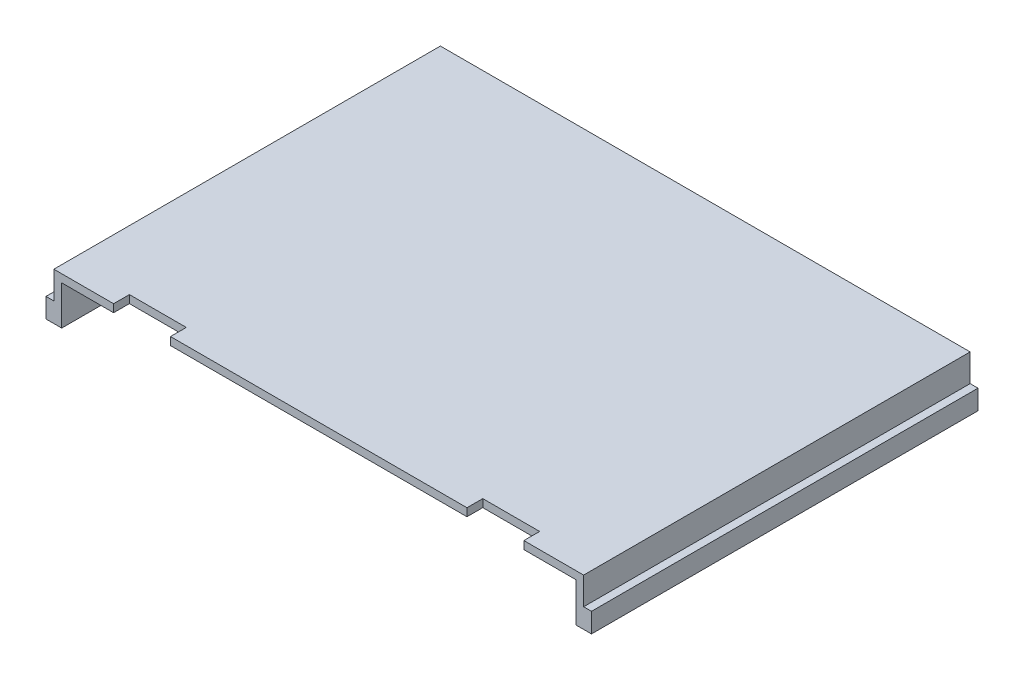
ISO-10303-21;
HEADER;
FILE_DESCRIPTION(('STEP AP214'),'2;1');
FILE_NAME('part.step','',(''),(''),'','','');
FILE_SCHEMA(('AUTOMOTIVE_DESIGN { 1 0 10303 214 1 1 1 1 }'));
ENDSEC;
DATA;
#1=APPLICATION_CONTEXT('core data for automotive mechanical design processes');
#2=APPLICATION_PROTOCOL_DEFINITION('international standard','automotive_design',2000,#1);
#3=PRODUCT_CONTEXT('',#1,'mechanical');
#4=PRODUCT('Part','Part','',(#3));
#5=PRODUCT_RELATED_PRODUCT_CATEGORY('part','',(#4));
#6=PRODUCT_DEFINITION_FORMATION('','',#4);
#7=PRODUCT_DEFINITION_CONTEXT('part definition',#1,'design');
#8=PRODUCT_DEFINITION('design','',#6,#7);
#9=PRODUCT_DEFINITION_SHAPE('','',#8);
#10=(LENGTH_UNIT() NAMED_UNIT(*) SI_UNIT(.MILLI.,.METRE.));
#11=(NAMED_UNIT(*) PLANE_ANGLE_UNIT() SI_UNIT($,.RADIAN.));
#12=(NAMED_UNIT(*) SI_UNIT($,.STERADIAN.) SOLID_ANGLE_UNIT());
#13=UNCERTAINTY_MEASURE_WITH_UNIT(LENGTH_MEASURE(1.E-05),#10,'distance_accuracy_value','');
#14=(GEOMETRIC_REPRESENTATION_CONTEXT(3) GLOBAL_UNCERTAINTY_ASSIGNED_CONTEXT((#13)) GLOBAL_UNIT_ASSIGNED_CONTEXT((#10,
#11,#12)) REPRESENTATION_CONTEXT('',''));
#15=CARTESIAN_POINT('',(0.,0.,0.));
#16=DIRECTION('',(0.,0.,1.));
#17=DIRECTION('',(1.,0.,0.));
#18=AXIS2_PLACEMENT_3D('',#15,#16,#17);
#19=CARTESIAN_POINT('',(0.,0.,197.));
#20=DIRECTION('',(0.,0.,1.));
#21=DIRECTION('',(1.,0.,0.));
#22=AXIS2_PLACEMENT_3D('',#19,#20,#21);
#23=PLANE('',#22);
#24=DIRECTION('',(0.,-1.,0.));
#25=VECTOR('',#24,1.);
#26=CARTESIAN_POINT('',(-20.1841463414634,0.,197.));
#27=LINE('',#26,#25);
#28=CARTESIAN_POINT('',(-20.1841463414634,10.0121951219512,197.));
#29=VERTEX_POINT('',#28);
#30=CARTESIAN_POINT('',(-20.1841463414634,6.01219512195124,197.));
#31=VERTEX_POINT('',#30);
#32=EDGE_CURVE('E186',#29,#31,#27,.T.);
#33=ORIENTED_EDGE('',*,*,#32,.F.);
#34=DIRECTION('',(-1.,0.,0.));
#35=VECTOR('',#34,1.);
#36=CARTESIAN_POINT('',(219.365853658537,10.0121951219513,197.));
#37=LINE('',#36,#35);
#38=CARTESIAN_POINT('',(-50.6341463414634,10.0121951219512,197.));
#39=VERTEX_POINT('',#38);
#40=EDGE_CURVE('E200',#29,#39,#37,.T.);
#41=ORIENTED_EDGE('',*,*,#40,.T.);
#42=DIRECTION('',(0.,-1.,0.));
#43=VECTOR('',#42,1.);
#44=CARTESIAN_POINT('',(-50.6341463414634,10.0121951219512,197.));
#45=LINE('',#44,#43);
#46=CARTESIAN_POINT('',(-50.6341463414634,-3.98780487804878,197.));
#47=VERTEX_POINT('',#46);
#48=EDGE_CURVE('E224',#39,#47,#45,.T.);
#49=ORIENTED_EDGE('',*,*,#48,.T.);
#50=DIRECTION('',(-1.,0.,0.));
#51=VECTOR('',#50,1.);
#52=CARTESIAN_POINT('',(-50.6341463414634,-3.98780487804878,197.));
#53=LINE('',#52,#51);
#54=CARTESIAN_POINT('',(-54.6341463414634,-3.98780487804878,197.));
#55=VERTEX_POINT('',#54);
#56=EDGE_CURVE('E229',#47,#55,#53,.T.);
#57=ORIENTED_EDGE('',*,*,#56,.T.);
#58=DIRECTION('',(0.,-1.,0.));
#59=VECTOR('',#58,1.);
#60=CARTESIAN_POINT('',(-54.6341463414634,-3.98780487804878,197.));
#61=LINE('',#60,#59);
#62=CARTESIAN_POINT('',(-54.6341463414634,-13.9878048780488,197.));
#63=VERTEX_POINT('',#62);
#64=EDGE_CURVE('E232',#55,#63,#61,.T.);
#65=ORIENTED_EDGE('',*,*,#64,.T.);
#66=DIRECTION('',(1.,0.,0.));
#67=VECTOR('',#66,1.);
#68=CARTESIAN_POINT('',(-54.6341463414634,-13.9878048780488,197.));
#69=LINE('',#68,#67);
#70=CARTESIAN_POINT('',(-46.6341463414634,-13.9878048780488,197.));
#71=VERTEX_POINT('',#70);
#72=EDGE_CURVE('E237',#63,#71,#69,.T.);
#73=ORIENTED_EDGE('',*,*,#72,.T.);
#74=DIRECTION('',(0.,1.,0.));
#75=VECTOR('',#74,1.);
#76=CARTESIAN_POINT('',(-46.6341463414634,-3.98780487804878,197.));
#77=LINE('',#76,#75);
#78=CARTESIAN_POINT('',(-46.6341463414634,6.01219512195122,197.));
#79=VERTEX_POINT('',#78);
#80=EDGE_CURVE('E240',#71,#79,#77,.T.);
#81=ORIENTED_EDGE('',*,*,#80,.T.);
#82=DIRECTION('',(1.,0.,0.));
#83=VECTOR('',#82,1.);
#84=CARTESIAN_POINT('',(-46.6341463414634,6.01219512195122,197.));
#85=LINE('',#84,#83);
#86=EDGE_CURVE('E203',#79,#31,#85,.T.);
#87=ORIENTED_EDGE('',*,*,#86,.T.);
#88=EDGE_LOOP('',(#33,#41,#49,#57,#65,#73,#81,#87));
#89=FACE_BOUND('',#88,.T.);
#90=ADVANCED_FACE('F45',(#89),#23,.T.);
#91=DIRECTION('',(0.,1.,0.));
#92=VECTOR('',#91,1.);
#93=CARTESIAN_POINT('',(188.915853658537,0.,197.));
#94=LINE('',#93,#92);
#95=CARTESIAN_POINT('',(188.915853658537,6.01219512195124,197.));
#96=VERTEX_POINT('',#95);
#97=CARTESIAN_POINT('',(188.915853658537,10.0121951219513,197.));
#98=VERTEX_POINT('',#97);
#99=EDGE_CURVE('E340',#96,#98,#94,.T.);
#100=ORIENTED_EDGE('',*,*,#99,.F.);
#101=CARTESIAN_POINT('',(215.365853658537,6.01219512195126,197.));
#102=VERTEX_POINT('',#101);
#103=EDGE_CURVE('E243',#96,#102,#85,.T.);
#104=ORIENTED_EDGE('',*,*,#103,.T.);
#105=DIRECTION('',(0.,-1.,0.));
#106=VECTOR('',#105,1.);
#107=CARTESIAN_POINT('',(215.365853658537,-3.98780487804874,197.));
#108=LINE('',#107,#106);
#109=CARTESIAN_POINT('',(215.365853658537,-13.9878048780487,197.));
#110=VERTEX_POINT('',#109);
#111=EDGE_CURVE('E246',#102,#110,#108,.T.);
#112=ORIENTED_EDGE('',*,*,#111,.T.);
#113=DIRECTION('',(1.,0.,0.));
#114=VECTOR('',#113,1.);
#115=CARTESIAN_POINT('',(223.365853658537,-13.9878048780487,197.));
#116=LINE('',#115,#114);
#117=CARTESIAN_POINT('',(223.365853658537,-13.9878048780487,197.));
#118=VERTEX_POINT('',#117);
#119=EDGE_CURVE('E291',#110,#118,#116,.T.);
#120=ORIENTED_EDGE('',*,*,#119,.T.);
#121=DIRECTION('',(0.,1.,0.));
#122=VECTOR('',#121,1.);
#123=CARTESIAN_POINT('',(223.365853658537,-3.98780487804874,197.));
#124=LINE('',#123,#122);
#125=CARTESIAN_POINT('',(223.365853658537,-3.98780487804874,197.));
#126=VERTEX_POINT('',#125);
#127=EDGE_CURVE('E391',#118,#126,#124,.T.);
#128=ORIENTED_EDGE('',*,*,#127,.T.);
#129=DIRECTION('',(-1.,0.,0.));
#130=VECTOR('',#129,1.);
#131=CARTESIAN_POINT('',(219.365853658537,-3.98780487804874,197.));
#132=LINE('',#131,#130);
#133=CARTESIAN_POINT('',(219.365853658537,-3.98780487804874,197.));
#134=VERTEX_POINT('',#133);
#135=EDGE_CURVE('E219',#126,#134,#132,.T.);
#136=ORIENTED_EDGE('',*,*,#135,.T.);
#137=DIRECTION('',(0.,1.,0.));
#138=VECTOR('',#137,1.);
#139=CARTESIAN_POINT('',(219.365853658537,10.0121951219513,197.));
#140=LINE('',#139,#138);
#141=CARTESIAN_POINT('',(219.365853658537,10.0121951219513,197.));
#142=VERTEX_POINT('',#141);
#143=EDGE_CURVE('E213',#134,#142,#140,.T.);
#144=ORIENTED_EDGE('',*,*,#143,.T.);
#145=EDGE_CURVE('E215',#142,#98,#37,.T.);
#146=ORIENTED_EDGE('',*,*,#145,.T.);
#147=EDGE_LOOP('',(#100,#104,#112,#120,#128,#136,#144,#146));
#148=FACE_BOUND('',#147,.T.);
#149=ADVANCED_FACE('F397',(#148),#23,.T.);
#150=CARTESIAN_POINT('',(223.365853658537,-3.98780487804874,197.));
#151=DIRECTION('',(-1.,0.,0.));
#152=DIRECTION('',(0.,0.,1.));
#153=AXIS2_PLACEMENT_3D('',#150,#151,#152);
#154=PLANE('',#153);
#155=DIRECTION('',(0.,1.,0.));
#156=VECTOR('',#155,1.);
#157=CARTESIAN_POINT('',(223.365853658537,-3.98780487804874,0.));
#158=LINE('',#157,#156);
#159=CARTESIAN_POINT('',(223.365853658537,-13.9878048780487,0.));
#160=VERTEX_POINT('',#159);
#161=CARTESIAN_POINT('',(223.365853658537,-3.98780487804874,0.));
#162=VERTEX_POINT('',#161);
#163=EDGE_CURVE('E251',#160,#162,#158,.T.);
#164=ORIENTED_EDGE('',*,*,#163,.T.);
#165=DIRECTION('',(0.,0.,-1.));
#166=VECTOR('',#165,1.);
#167=CARTESIAN_POINT('',(223.365853658537,-3.98780487804874,197.));
#168=LINE('',#167,#166);
#169=EDGE_CURVE('E329',#126,#162,#168,.T.);
#170=ORIENTED_EDGE('',*,*,#169,.F.);
#171=ORIENTED_EDGE('',*,*,#127,.F.);
#172=DIRECTION('',(0.,0.,-1.));
#173=VECTOR('',#172,1.);
#174=CARTESIAN_POINT('',(223.365853658537,-13.9878048780487,197.));
#175=LINE('',#174,#173);
#176=EDGE_CURVE('E333',#118,#160,#175,.T.);
#177=ORIENTED_EDGE('',*,*,#176,.T.);
#178=EDGE_LOOP('',(#164,#170,#171,#177));
#179=FACE_BOUND('',#178,.T.);
#180=ADVANCED_FACE('F47',(#179),#154,.F.);
#181=CARTESIAN_POINT('',(219.365853658537,-3.98780487804874,197.));
#182=DIRECTION('',(0.,-1.,0.));
#183=DIRECTION('',(0.,0.,-1.));
#184=AXIS2_PLACEMENT_3D('',#181,#182,#183);
#185=PLANE('',#184);
#186=DIRECTION('',(-1.,0.,0.));
#187=VECTOR('',#186,1.);
#188=CARTESIAN_POINT('',(219.365853658537,-3.98780487804874,0.));
#189=LINE('',#188,#187);
#190=CARTESIAN_POINT('',(219.365853658537,-3.98780487804874,0.));
#191=VERTEX_POINT('',#190);
#192=EDGE_CURVE('E254',#162,#191,#189,.T.);
#193=ORIENTED_EDGE('',*,*,#192,.T.);
#194=DIRECTION('',(0.,0.,-1.));
#195=VECTOR('',#194,1.);
#196=CARTESIAN_POINT('',(219.365853658537,-3.98780487804874,197.));
#197=LINE('',#196,#195);
#198=EDGE_CURVE('E325',#134,#191,#197,.T.);
#199=ORIENTED_EDGE('',*,*,#198,.F.);
#200=ORIENTED_EDGE('',*,*,#135,.F.);
#201=ORIENTED_EDGE('',*,*,#169,.T.);
#202=EDGE_LOOP('',(#193,#199,#200,#201));
#203=FACE_BOUND('',#202,.T.);
#204=ADVANCED_FACE('F402',(#203),#185,.F.);
#205=CARTESIAN_POINT('',(219.365853658537,10.0121951219513,197.));
#206=DIRECTION('',(-1.,0.,0.));
#207=DIRECTION('',(0.,-1.,0.));
#208=AXIS2_PLACEMENT_3D('',#205,#206,#207);
#209=PLANE('',#208);
#210=DIRECTION('',(0.,1.,0.));
#211=VECTOR('',#210,1.);
#212=CARTESIAN_POINT('',(219.365853658537,10.0121951219513,0.));
#213=LINE('',#212,#211);
#214=CARTESIAN_POINT('',(219.365853658537,10.0121951219513,0.));
#215=VERTEX_POINT('',#214);
#216=EDGE_CURVE('E258',#191,#215,#213,.T.);
#217=ORIENTED_EDGE('',*,*,#216,.T.);
#218=DIRECTION('',(0.,0.,-1.));
#219=VECTOR('',#218,1.);
#220=CARTESIAN_POINT('',(219.365853658537,10.0121951219513,197.));
#221=LINE('',#220,#219);
#222=EDGE_CURVE('E321',#142,#215,#221,.T.);
#223=ORIENTED_EDGE('',*,*,#222,.F.);
#224=ORIENTED_EDGE('',*,*,#143,.F.);
#225=ORIENTED_EDGE('',*,*,#198,.T.);
#226=EDGE_LOOP('',(#217,#223,#224,#225));
#227=FACE_BOUND('',#226,.T.);
#228=ADVANCED_FACE('F406',(#227),#209,.F.);
#229=CARTESIAN_POINT('',(219.365853658537,10.0121951219513,197.));
#230=DIRECTION('',(0.,-1.,0.));
#231=DIRECTION('',(1.,0.,0.));
#232=AXIS2_PLACEMENT_3D('',#229,#230,#231);
#233=PLANE('',#232);
#234=ORIENTED_EDGE('',*,*,#40,.F.);
#235=DIRECTION('',(0.,0.,1.));
#236=VECTOR('',#235,1.);
#237=CARTESIAN_POINT('',(-20.1841463414634,10.0121951219512,197.));
#238=LINE('',#237,#236);
#239=CARTESIAN_POINT('',(-20.1841463414634,10.0121951219512,188.95));
#240=VERTEX_POINT('',#239);
#241=EDGE_CURVE('E183',#240,#29,#238,.T.);
#242=ORIENTED_EDGE('',*,*,#241,.F.);
#243=DIRECTION('',(-1.,0.,0.));
#244=VECTOR('',#243,1.);
#245=CARTESIAN_POINT('',(-20.1841463414634,10.0121951219512,188.95));
#246=LINE('',#245,#244);
#247=CARTESIAN_POINT('',(8.81585365853659,10.0121951219512,188.95));
#248=VERTEX_POINT('',#247);
#249=EDGE_CURVE('E496',#248,#240,#246,.T.);
#250=ORIENTED_EDGE('',*,*,#249,.F.);
#251=DIRECTION('',(0.,0.,-1.));
#252=VECTOR('',#251,1.);
#253=CARTESIAN_POINT('',(8.8158536585366,10.0121951219512,197.));
#254=LINE('',#253,#252);
#255=CARTESIAN_POINT('',(8.8158536585366,10.0121951219512,197.));
#256=VERTEX_POINT('',#255);
#257=EDGE_CURVE('E195',#256,#248,#254,.T.);
#258=ORIENTED_EDGE('',*,*,#257,.F.);
#259=CARTESIAN_POINT('',(159.915853658537,10.0121951219513,197.));
#260=VERTEX_POINT('',#259);
#261=EDGE_CURVE('E212',#260,#256,#37,.T.);
#262=ORIENTED_EDGE('',*,*,#261,.F.);
#263=DIRECTION('',(0.,0.,1.));
#264=VECTOR('',#263,1.);
#265=CARTESIAN_POINT('',(159.915853658537,10.0121951219513,197.));
#266=LINE('',#265,#264);
#267=CARTESIAN_POINT('',(159.915853658537,10.0121951219513,188.95));
#268=VERTEX_POINT('',#267);
#269=EDGE_CURVE('E69',#268,#260,#266,.T.);
#270=ORIENTED_EDGE('',*,*,#269,.F.);
#271=DIRECTION('',(-1.,0.,0.));
#272=VECTOR('',#271,1.);
#273=CARTESIAN_POINT('',(159.915853658537,10.0121951219513,188.95));
#274=LINE('',#273,#272);
#275=CARTESIAN_POINT('',(188.915853658537,10.0121951219513,188.95));
#276=VERTEX_POINT('',#275);
#277=EDGE_CURVE('E196',#276,#268,#274,.T.);
#278=ORIENTED_EDGE('',*,*,#277,.F.);
#279=DIRECTION('',(0.,0.,-1.));
#280=VECTOR('',#279,1.);
#281=CARTESIAN_POINT('',(188.915853658537,10.0121951219513,197.));
#282=LINE('',#281,#280);
#283=EDGE_CURVE('E366',#98,#276,#282,.T.);
#284=ORIENTED_EDGE('',*,*,#283,.F.);
#285=ORIENTED_EDGE('',*,*,#145,.F.);
#286=ORIENTED_EDGE('',*,*,#222,.T.);
#287=DIRECTION('',(-1.,0.,0.));
#288=VECTOR('',#287,1.);
#289=CARTESIAN_POINT('',(219.365853658537,10.0121951219513,0.));
#290=LINE('',#289,#288);
#291=CARTESIAN_POINT('',(-50.6341463414634,10.0121951219512,0.));
#292=VERTEX_POINT('',#291);
#293=EDGE_CURVE('E261',#215,#292,#290,.T.);
#294=ORIENTED_EDGE('',*,*,#293,.T.);
#295=DIRECTION('',(0.,0.,-1.));
#296=VECTOR('',#295,1.);
#297=CARTESIAN_POINT('',(-50.6341463414634,10.0121951219512,197.));
#298=LINE('',#297,#296);
#299=EDGE_CURVE('E209',#39,#292,#298,.T.);
#300=ORIENTED_EDGE('',*,*,#299,.F.);
#301=EDGE_LOOP('',(#234,#242,#250,#258,#262,#270,#278,#284,#285,#286,#294,#300));
#302=FACE_BOUND('',#301,.T.);
#303=ADVANCED_FACE('F207',(#302),#233,.F.);
#304=CARTESIAN_POINT('',(-50.6341463414634,10.0121951219512,197.));
#305=DIRECTION('',(1.,0.,0.));
#306=DIRECTION('',(0.,1.,0.));
#307=AXIS2_PLACEMENT_3D('',#304,#305,#306);
#308=PLANE('',#307);
#309=DIRECTION('',(0.,-1.,0.));
#310=VECTOR('',#309,1.);
#311=CARTESIAN_POINT('',(-50.6341463414634,10.0121951219512,0.));
#312=LINE('',#311,#310);
#313=CARTESIAN_POINT('',(-50.6341463414634,-3.98780487804878,0.));
#314=VERTEX_POINT('',#313);
#315=EDGE_CURVE('E264',#292,#314,#312,.T.);
#316=ORIENTED_EDGE('',*,*,#315,.T.);
#317=DIRECTION('',(0.,0.,-1.));
#318=VECTOR('',#317,1.);
#319=CARTESIAN_POINT('',(-50.6341463414634,-3.98780487804878,197.));
#320=LINE('',#319,#318);
#321=EDGE_CURVE('E315',#47,#314,#320,.T.);
#322=ORIENTED_EDGE('',*,*,#321,.F.);
#323=ORIENTED_EDGE('',*,*,#48,.F.);
#324=ORIENTED_EDGE('',*,*,#299,.T.);
#325=EDGE_LOOP('',(#316,#322,#323,#324));
#326=FACE_BOUND('',#325,.T.);
#327=ADVANCED_FACE('F466',(#326),#308,.F.);
#328=CARTESIAN_POINT('',(-50.6341463414634,-3.98780487804878,197.));
#329=DIRECTION('',(0.,-1.,0.));
#330=DIRECTION('',(1.,0.,0.));
#331=AXIS2_PLACEMENT_3D('',#328,#329,#330);
#332=PLANE('',#331);
#333=DIRECTION('',(-1.,0.,0.));
#334=VECTOR('',#333,1.);
#335=CARTESIAN_POINT('',(-50.6341463414634,-3.98780487804878,0.));
#336=LINE('',#335,#334);
#337=CARTESIAN_POINT('',(-54.6341463414634,-3.98780487804878,0.));
#338=VERTEX_POINT('',#337);
#339=EDGE_CURVE('E267',#314,#338,#336,.T.);
#340=ORIENTED_EDGE('',*,*,#339,.T.);
#341=DIRECTION('',(0.,0.,-1.));
#342=VECTOR('',#341,1.);
#343=CARTESIAN_POINT('',(-54.6341463414634,-3.98780487804878,197.));
#344=LINE('',#343,#342);
#345=EDGE_CURVE('E311',#55,#338,#344,.T.);
#346=ORIENTED_EDGE('',*,*,#345,.F.);
#347=ORIENTED_EDGE('',*,*,#56,.F.);
#348=ORIENTED_EDGE('',*,*,#321,.T.);
#349=EDGE_LOOP('',(#340,#346,#347,#348));
#350=FACE_BOUND('',#349,.T.);
#351=ADVANCED_FACE('F462',(#350),#332,.F.);
#352=CARTESIAN_POINT('',(-54.6341463414634,-3.98780487804878,197.));
#353=DIRECTION('',(1.,0.,0.));
#354=DIRECTION('',(0.,0.,-1.));
#355=AXIS2_PLACEMENT_3D('',#352,#353,#354);
#356=PLANE('',#355);
#357=DIRECTION('',(0.,-1.,0.));
#358=VECTOR('',#357,1.);
#359=CARTESIAN_POINT('',(-54.6341463414634,-3.98780487804878,0.));
#360=LINE('',#359,#358);
#361=CARTESIAN_POINT('',(-54.6341463414634,-13.9878048780488,0.));
#362=VERTEX_POINT('',#361);
#363=EDGE_CURVE('E270',#338,#362,#360,.T.);
#364=ORIENTED_EDGE('',*,*,#363,.T.);
#365=DIRECTION('',(0.,0.,-1.));
#366=VECTOR('',#365,1.);
#367=CARTESIAN_POINT('',(-54.6341463414634,-13.9878048780488,197.));
#368=LINE('',#367,#366);
#369=EDGE_CURVE('E307',#63,#362,#368,.T.);
#370=ORIENTED_EDGE('',*,*,#369,.F.);
#371=ORIENTED_EDGE('',*,*,#64,.F.);
#372=ORIENTED_EDGE('',*,*,#345,.T.);
#373=EDGE_LOOP('',(#364,#370,#371,#372));
#374=FACE_BOUND('',#373,.T.);
#375=ADVANCED_FACE('F458',(#374),#356,.F.);
#376=CARTESIAN_POINT('',(-46.6341463414634,-13.9878048780488,197.));
#377=DIRECTION('',(0.,1.,0.));
#378=DIRECTION('',(-1.,0.,0.));
#379=AXIS2_PLACEMENT_3D('',#376,#377,#378);
#380=PLANE('',#379);
#381=DIRECTION('',(1.,0.,0.));
#382=VECTOR('',#381,1.);
#383=CARTESIAN_POINT('',(-46.6341463414634,-13.9878048780488,0.));
#384=LINE('',#383,#382);
#385=CARTESIAN_POINT('',(-46.6341463414634,-13.9878048780488,0.));
#386=VERTEX_POINT('',#385);
#387=EDGE_CURVE('E274',#362,#386,#384,.T.);
#388=ORIENTED_EDGE('',*,*,#387,.T.);
#389=DIRECTION('',(0.,0.,-1.));
#390=VECTOR('',#389,1.);
#391=CARTESIAN_POINT('',(-46.6341463414634,-13.9878048780488,197.));
#392=LINE('',#391,#390);
#393=EDGE_CURVE('E303',#71,#386,#392,.T.);
#394=ORIENTED_EDGE('',*,*,#393,.F.);
#395=ORIENTED_EDGE('',*,*,#72,.F.);
#396=ORIENTED_EDGE('',*,*,#369,.T.);
#397=EDGE_LOOP('',(#388,#394,#395,#396));
#398=FACE_BOUND('',#397,.T.);
#399=ADVANCED_FACE('F454',(#398),#380,.F.);
#400=CARTESIAN_POINT('',(-46.6341463414634,-3.98780487804878,197.));
#401=DIRECTION('',(-1.,0.,0.));
#402=DIRECTION('',(0.,0.,1.));
#403=AXIS2_PLACEMENT_3D('',#400,#401,#402);
#404=PLANE('',#403);
#405=DIRECTION('',(0.,1.,0.));
#406=VECTOR('',#405,1.);
#407=CARTESIAN_POINT('',(-46.6341463414634,-3.98780487804878,0.));
#408=LINE('',#407,#406);
#409=CARTESIAN_POINT('',(-46.6341463414634,6.01219512195122,0.));
#410=VERTEX_POINT('',#409);
#411=EDGE_CURVE('E278',#386,#410,#408,.T.);
#412=ORIENTED_EDGE('',*,*,#411,.T.);
#413=DIRECTION('',(0.,0.,-1.));
#414=VECTOR('',#413,1.);
#415=CARTESIAN_POINT('',(-46.6341463414634,6.01219512195122,197.));
#416=LINE('',#415,#414);
#417=EDGE_CURVE('E299',#79,#410,#416,.T.);
#418=ORIENTED_EDGE('',*,*,#417,.F.);
#419=ORIENTED_EDGE('',*,*,#80,.F.);
#420=ORIENTED_EDGE('',*,*,#393,.T.);
#421=EDGE_LOOP('',(#412,#418,#419,#420));
#422=FACE_BOUND('',#421,.T.);
#423=ADVANCED_FACE('F451',(#422),#404,.F.);
#424=CARTESIAN_POINT('',(-46.6341463414634,6.01219512195122,197.));
#425=DIRECTION('',(0.,1.,0.));
#426=DIRECTION('',(-1.,0.,0.));
#427=AXIS2_PLACEMENT_3D('',#424,#425,#426);
#428=PLANE('',#427);
#429=DIRECTION('',(-1.,0.,0.));
#430=VECTOR('',#429,1.);
#431=CARTESIAN_POINT('',(-46.6341463414634,6.01219512195122,188.95));
#432=LINE('',#431,#430);
#433=CARTESIAN_POINT('',(8.81585365853659,6.01219512195123,188.95));
#434=VERTEX_POINT('',#433);
#435=CARTESIAN_POINT('',(-20.1841463414634,6.01219512195123,188.95));
#436=VERTEX_POINT('',#435);
#437=EDGE_CURVE('E11',#434,#436,#432,.T.);
#438=ORIENTED_EDGE('',*,*,#437,.T.);
#439=DIRECTION('',(0.,0.,1.));
#440=VECTOR('',#439,1.);
#441=CARTESIAN_POINT('',(-20.1841463414634,6.01219512195122,197.));
#442=LINE('',#441,#440);
#443=EDGE_CURVE('E255',#436,#31,#442,.T.);
#444=ORIENTED_EDGE('',*,*,#443,.T.);
#445=ORIENTED_EDGE('',*,*,#86,.F.);
#446=ORIENTED_EDGE('',*,*,#417,.T.);
#447=DIRECTION('',(1.,0.,0.));
#448=VECTOR('',#447,1.);
#449=CARTESIAN_POINT('',(-46.6341463414634,6.01219512195122,0.));
#450=LINE('',#449,#448);
#451=CARTESIAN_POINT('',(215.365853658537,6.01219512195126,0.));
#452=VERTEX_POINT('',#451);
#453=EDGE_CURVE('E281',#410,#452,#450,.T.);
#454=ORIENTED_EDGE('',*,*,#453,.T.);
#455=DIRECTION('',(0.,0.,-1.));
#456=VECTOR('',#455,1.);
#457=CARTESIAN_POINT('',(215.365853658537,6.01219512195126,197.));
#458=LINE('',#457,#456);
#459=EDGE_CURVE('E295',#102,#452,#458,.T.);
#460=ORIENTED_EDGE('',*,*,#459,.F.);
#461=ORIENTED_EDGE('',*,*,#103,.F.);
#462=DIRECTION('',(0.,0.,-1.));
#463=VECTOR('',#462,1.);
#464=CARTESIAN_POINT('',(188.915853658537,6.01219512195126,197.));
#465=LINE('',#464,#463);
#466=CARTESIAN_POINT('',(188.915853658537,6.01219512195125,188.95));
#467=VERTEX_POINT('',#466);
#468=EDGE_CURVE('E354',#96,#467,#465,.T.);
#469=ORIENTED_EDGE('',*,*,#468,.T.);
#470=DIRECTION('',(-1.,0.,0.));
#471=VECTOR('',#470,1.);
#472=CARTESIAN_POINT('',(-46.6341463414634,6.01219512195122,188.95));
#473=LINE('',#472,#471);
#474=CARTESIAN_POINT('',(159.915853658537,6.01219512195125,188.95));
#475=VERTEX_POINT('',#474);
#476=EDGE_CURVE('E54',#467,#475,#473,.T.);
#477=ORIENTED_EDGE('',*,*,#476,.T.);
#478=DIRECTION('',(0.,0.,1.));
#479=VECTOR('',#478,1.);
#480=CARTESIAN_POINT('',(159.915853658537,6.01219512195125,197.));
#481=LINE('',#480,#479);
#482=CARTESIAN_POINT('',(159.915853658537,6.01219512195124,197.));
#483=VERTEX_POINT('',#482);
#484=EDGE_CURVE('E351',#475,#483,#481,.T.);
#485=ORIENTED_EDGE('',*,*,#484,.T.);
#486=CARTESIAN_POINT('',(8.8158536585366,6.01219512195123,197.));
#487=VERTEX_POINT('',#486);
#488=EDGE_CURVE('E247',#487,#483,#85,.T.);
#489=ORIENTED_EDGE('',*,*,#488,.F.);
#490=DIRECTION('',(0.,0.,-1.));
#491=VECTOR('',#490,1.);
#492=CARTESIAN_POINT('',(8.81585365853661,6.01219512195123,197.));
#493=LINE('',#492,#491);
#494=EDGE_CURVE('E61',#487,#434,#493,.T.);
#495=ORIENTED_EDGE('',*,*,#494,.T.);
#496=EDGE_LOOP('',(#438,#444,#445,#446,#454,#460,#461,#469,#477,#485,#489,#495));
#497=FACE_BOUND('',#496,.T.);
#498=ADVANCED_FACE('F349',(#497),#428,.F.);
#499=CARTESIAN_POINT('',(215.365853658537,-3.98780487804874,197.));
#500=DIRECTION('',(1.,0.,0.));
#501=DIRECTION('',(0.,0.,-1.));
#502=AXIS2_PLACEMENT_3D('',#499,#500,#501);
#503=PLANE('',#502);
#504=DIRECTION('',(0.,-1.,0.));
#505=VECTOR('',#504,1.);
#506=CARTESIAN_POINT('',(215.365853658537,-3.98780487804874,0.));
#507=LINE('',#506,#505);
#508=CARTESIAN_POINT('',(215.365853658537,-13.9878048780487,0.));
#509=VERTEX_POINT('',#508);
#510=EDGE_CURVE('E285',#452,#509,#507,.T.);
#511=ORIENTED_EDGE('',*,*,#510,.T.);
#512=DIRECTION('',(0.,0.,-1.));
#513=VECTOR('',#512,1.);
#514=CARTESIAN_POINT('',(215.365853658537,-13.9878048780487,197.));
#515=LINE('',#514,#513);
#516=EDGE_CURVE('E250',#110,#509,#515,.T.);
#517=ORIENTED_EDGE('',*,*,#516,.F.);
#518=ORIENTED_EDGE('',*,*,#111,.F.);
#519=ORIENTED_EDGE('',*,*,#459,.T.);
#520=EDGE_LOOP('',(#511,#517,#518,#519));
#521=FACE_BOUND('',#520,.T.);
#522=ADVANCED_FACE('F441',(#521),#503,.F.);
#523=CARTESIAN_POINT('',(219.135770599959,-13.9878048780487,197.));
#524=DIRECTION('',(0.,1.,0.));
#525=DIRECTION('',(0.,0.,1.));
#526=AXIS2_PLACEMENT_3D('',#523,#524,#525);
#527=PLANE('',#526);
#528=DIRECTION('',(1.,0.,0.));
#529=VECTOR('',#528,1.);
#530=CARTESIAN_POINT('',(219.135770599959,-13.9878048780487,0.));
#531=LINE('',#530,#529);
#532=EDGE_CURVE('E288',#509,#160,#531,.T.);
#533=ORIENTED_EDGE('',*,*,#532,.T.);
#534=ORIENTED_EDGE('',*,*,#176,.F.);
#535=ORIENTED_EDGE('',*,*,#119,.F.);
#536=ORIENTED_EDGE('',*,*,#516,.T.);
#537=EDGE_LOOP('',(#533,#534,#535,#536));
#538=FACE_BOUND('',#537,.T.);
#539=ADVANCED_FACE('F434',(#538),#527,.F.);
#540=DIRECTION('',(0.,1.,0.));
#541=VECTOR('',#540,1.);
#542=CARTESIAN_POINT('',(8.8158536585366,0.,197.));
#543=LINE('',#542,#541);
#544=EDGE_CURVE('E205',#487,#256,#543,.T.);
#545=ORIENTED_EDGE('',*,*,#544,.F.);
#546=ORIENTED_EDGE('',*,*,#488,.T.);
#547=DIRECTION('',(0.,-1.,0.));
#548=VECTOR('',#547,1.);
#549=CARTESIAN_POINT('',(159.915853658537,0.,197.));
#550=LINE('',#549,#548);
#551=EDGE_CURVE('E337',#260,#483,#550,.T.);
#552=ORIENTED_EDGE('',*,*,#551,.F.);
#553=ORIENTED_EDGE('',*,*,#261,.T.);
#554=EDGE_LOOP('',(#545,#546,#552,#553));
#555=FACE_BOUND('',#554,.T.);
#556=ADVANCED_FACE('F412',(#555),#23,.T.);
#557=CARTESIAN_POINT('',(0.,0.,0.));
#558=DIRECTION('',(0.,0.,1.));
#559=DIRECTION('',(1.,0.,0.));
#560=AXIS2_PLACEMENT_3D('',#557,#558,#559);
#561=PLANE('',#560);
#562=ORIENTED_EDGE('',*,*,#163,.F.);
#563=ORIENTED_EDGE('',*,*,#532,.F.);
#564=ORIENTED_EDGE('',*,*,#510,.F.);
#565=ORIENTED_EDGE('',*,*,#453,.F.);
#566=ORIENTED_EDGE('',*,*,#411,.F.);
#567=ORIENTED_EDGE('',*,*,#387,.F.);
#568=ORIENTED_EDGE('',*,*,#363,.F.);
#569=ORIENTED_EDGE('',*,*,#339,.F.);
#570=ORIENTED_EDGE('',*,*,#315,.F.);
#571=ORIENTED_EDGE('',*,*,#293,.F.);
#572=ORIENTED_EDGE('',*,*,#216,.F.);
#573=ORIENTED_EDGE('',*,*,#192,.F.);
#574=EDGE_LOOP('',(#562,#563,#564,#565,#566,#567,#568,#569,#570,#571,#572,#573));
#575=FACE_BOUND('',#574,.T.);
#576=ADVANCED_FACE('F433',(#575),#561,.F.);
#577=CARTESIAN_POINT('',(159.915853658537,-13.9878048780488,188.95));
#578=DIRECTION('',(0.,0.,-1.));
#579=DIRECTION('',(-1.,0.,0.));
#580=AXIS2_PLACEMENT_3D('',#577,#578,#579);
#581=PLANE('',#580);
#582=DIRECTION('',(0.,1.,0.));
#583=VECTOR('',#582,1.);
#584=CARTESIAN_POINT('',(188.915853658537,-13.9878048780488,188.95));
#585=LINE('',#584,#583);
#586=EDGE_CURVE('E360',#467,#276,#585,.T.);
#587=ORIENTED_EDGE('',*,*,#586,.T.);
#588=ORIENTED_EDGE('',*,*,#277,.T.);
#589=DIRECTION('',(0.,1.,0.));
#590=VECTOR('',#589,1.);
#591=CARTESIAN_POINT('',(159.915853658537,-13.9878048780488,188.95));
#592=LINE('',#591,#590);
#593=EDGE_CURVE('E362',#475,#268,#592,.T.);
#594=ORIENTED_EDGE('',*,*,#593,.F.);
#595=ORIENTED_EDGE('',*,*,#476,.F.);
#596=EDGE_LOOP('',(#587,#588,#594,#595));
#597=FACE_BOUND('',#596,.T.);
#598=ADVANCED_FACE('F358',(#597),#581,.F.);
#599=CARTESIAN_POINT('',(188.915853658537,-13.9878048780488,197.));
#600=DIRECTION('',(1.,0.,0.));
#601=DIRECTION('',(0.,1.,0.));
#602=AXIS2_PLACEMENT_3D('',#599,#600,#601);
#603=PLANE('',#602);
#604=ORIENTED_EDGE('',*,*,#99,.T.);
#605=ORIENTED_EDGE('',*,*,#283,.T.);
#606=ORIENTED_EDGE('',*,*,#586,.F.);
#607=ORIENTED_EDGE('',*,*,#468,.F.);
#608=EDGE_LOOP('',(#604,#605,#606,#607));
#609=FACE_BOUND('',#608,.T.);
#610=ADVANCED_FACE('F364',(#609),#603,.F.);
#611=CARTESIAN_POINT('',(159.915853658537,-13.9878048780488,197.));
#612=DIRECTION('',(-1.,0.,0.));
#613=DIRECTION('',(0.,-1.,0.));
#614=AXIS2_PLACEMENT_3D('',#611,#612,#613);
#615=PLANE('',#614);
#616=ORIENTED_EDGE('',*,*,#593,.T.);
#617=ORIENTED_EDGE('',*,*,#269,.T.);
#618=ORIENTED_EDGE('',*,*,#551,.T.);
#619=ORIENTED_EDGE('',*,*,#484,.F.);
#620=EDGE_LOOP('',(#616,#617,#618,#619));
#621=FACE_BOUND('',#620,.T.);
#622=ADVANCED_FACE('F413',(#621),#615,.F.);
#623=CARTESIAN_POINT('',(-20.1841463414634,-13.9878048780488,188.95));
#624=DIRECTION('',(0.,0.,-1.));
#625=DIRECTION('',(-1.,0.,0.));
#626=AXIS2_PLACEMENT_3D('',#623,#624,#625);
#627=PLANE('',#626);
#628=DIRECTION('',(0.,1.,0.));
#629=VECTOR('',#628,1.);
#630=CARTESIAN_POINT('',(8.8158536585366,-13.9878048780488,188.95));
#631=LINE('',#630,#629);
#632=EDGE_CURVE('E498',#434,#248,#631,.T.);
#633=ORIENTED_EDGE('',*,*,#632,.T.);
#634=ORIENTED_EDGE('',*,*,#249,.T.);
#635=DIRECTION('',(0.,1.,0.));
#636=VECTOR('',#635,1.);
#637=CARTESIAN_POINT('',(-20.1841463414634,-13.9878048780488,188.95));
#638=LINE('',#637,#636);
#639=EDGE_CURVE('E189',#436,#240,#638,.T.);
#640=ORIENTED_EDGE('',*,*,#639,.F.);
#641=ORIENTED_EDGE('',*,*,#437,.F.);
#642=EDGE_LOOP('',(#633,#634,#640,#641));
#643=FACE_BOUND('',#642,.T.);
#644=ADVANCED_FACE('F415',(#643),#627,.F.);
#645=CARTESIAN_POINT('',(-20.1841463414634,-13.9878048780488,197.));
#646=DIRECTION('',(-1.,0.,0.));
#647=DIRECTION('',(0.,0.,1.));
#648=AXIS2_PLACEMENT_3D('',#645,#646,#647);
#649=PLANE('',#648);
#650=ORIENTED_EDGE('',*,*,#639,.T.);
#651=ORIENTED_EDGE('',*,*,#241,.T.);
#652=ORIENTED_EDGE('',*,*,#32,.T.);
#653=ORIENTED_EDGE('',*,*,#443,.F.);
#654=EDGE_LOOP('',(#650,#651,#652,#653));
#655=FACE_BOUND('',#654,.T.);
#656=ADVANCED_FACE('F185',(#655),#649,.F.);
#657=CARTESIAN_POINT('',(8.8158536585366,-13.9878048780488,197.));
#658=DIRECTION('',(1.,0.,0.));
#659=DIRECTION('',(0.,0.,-1.));
#660=AXIS2_PLACEMENT_3D('',#657,#658,#659);
#661=PLANE('',#660);
#662=ORIENTED_EDGE('',*,*,#544,.T.);
#663=ORIENTED_EDGE('',*,*,#257,.T.);
#664=ORIENTED_EDGE('',*,*,#632,.F.);
#665=ORIENTED_EDGE('',*,*,#494,.F.);
#666=EDGE_LOOP('',(#662,#663,#664,#665));
#667=FACE_BOUND('',#666,.T.);
#668=ADVANCED_FACE('F505',(#667),#661,.F.);
#669=CLOSED_SHELL('',(#90,#149,#180,#204,#228,#303,#327,#351,#375,#399,#423,#498,#522,#539,#556,
#576,#598,#610,#622,#644,#656,#668));
#670=MANIFOLD_SOLID_BREP('B2',#669);
#671=ADVANCED_BREP_SHAPE_REPRESENTATION('',(#18,#670),#14);
#672=SHAPE_DEFINITION_REPRESENTATION(#9,#671);
ENDSEC;
END-ISO-10303-21;
